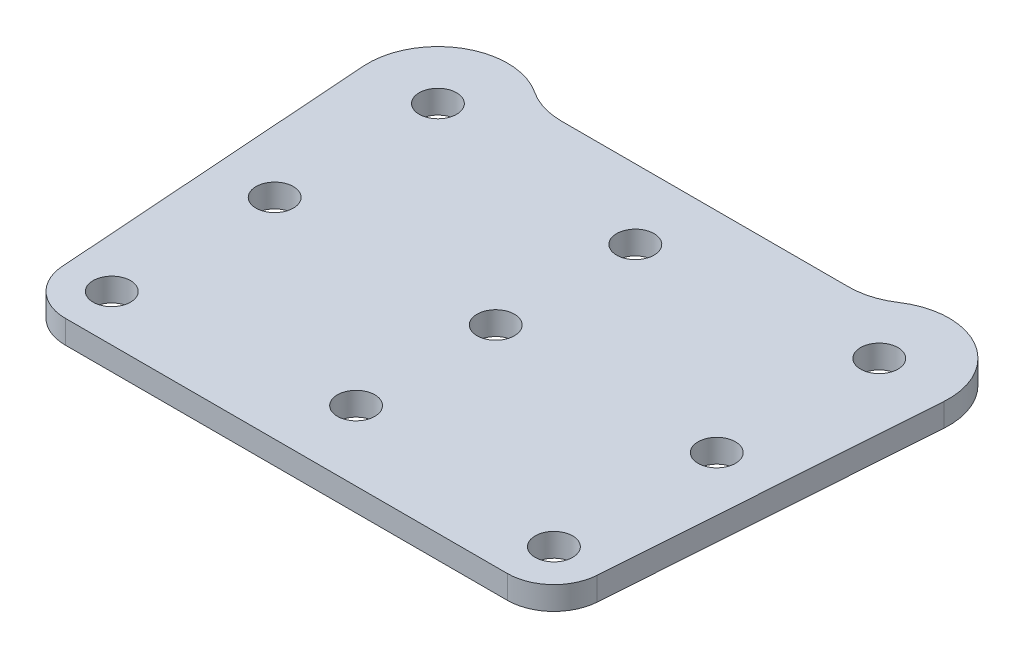
ISO-10303-21;
HEADER;
FILE_DESCRIPTION(('STEP AP214'),'2;1');
FILE_NAME('part.step','',(''),(''),'','','');
FILE_SCHEMA(('AUTOMOTIVE_DESIGN { 1 0 10303 214 1 1 1 1 }'));
ENDSEC;
DATA;
#1=APPLICATION_CONTEXT('core data for automotive mechanical design processes');
#2=APPLICATION_PROTOCOL_DEFINITION('international standard','automotive_design',2000,#1);
#3=PRODUCT_CONTEXT('',#1,'mechanical');
#4=PRODUCT('Part','Part','',(#3));
#5=PRODUCT_RELATED_PRODUCT_CATEGORY('part','',(#4));
#6=PRODUCT_DEFINITION_FORMATION('','',#4);
#7=PRODUCT_DEFINITION_CONTEXT('part definition',#1,'design');
#8=PRODUCT_DEFINITION('design','',#6,#7);
#9=PRODUCT_DEFINITION_SHAPE('','',#8);
#10=(LENGTH_UNIT() NAMED_UNIT(*) SI_UNIT(.MILLI.,.METRE.));
#11=(NAMED_UNIT(*) PLANE_ANGLE_UNIT() SI_UNIT($,.RADIAN.));
#12=(NAMED_UNIT(*) SI_UNIT($,.STERADIAN.) SOLID_ANGLE_UNIT());
#13=UNCERTAINTY_MEASURE_WITH_UNIT(LENGTH_MEASURE(1.E-05),#10,'distance_accuracy_value','');
#14=(GEOMETRIC_REPRESENTATION_CONTEXT(3) GLOBAL_UNCERTAINTY_ASSIGNED_CONTEXT((#13)) GLOBAL_UNIT_ASSIGNED_CONTEXT((#10,
#11,#12)) REPRESENTATION_CONTEXT('',''));
#15=CARTESIAN_POINT('',(0.,0.,0.));
#16=DIRECTION('',(0.,0.,1.));
#17=DIRECTION('',(1.,0.,0.));
#18=AXIS2_PLACEMENT_3D('',#15,#16,#17);
#19=CARTESIAN_POINT('',(-30.1135034,0.,-31.75));
#20=DIRECTION('',(0.,1.,0.));
#21=DIRECTION('',(0.,0.,1.));
#22=AXIS2_PLACEMENT_3D('',#19,#20,#21);
#23=PLANE('',#22);
#24=CARTESIAN_POINT('',(30.1625,0.,-9.52500000000001));
#25=DIRECTION('',(0.,-1.,0.));
#26=DIRECTION('',(0.,0.,-1.));
#27=AXIS2_PLACEMENT_3D('',#24,#25,#26);
#28=CIRCLE('',#27,2.5527);
#29=CARTESIAN_POINT('',(30.1625,0.,-12.0777));
#30=VERTEX_POINT('',#29);
#31=EDGE_CURVE('E164',#30,#30,#28,.F.);
#32=ORIENTED_EDGE('',*,*,#31,.T.);
#33=EDGE_LOOP('',(#32));
#34=FACE_BOUND('',#33,.T.);
#35=CARTESIAN_POINT('',(-30.1625,0.,-9.525));
#36=DIRECTION('',(0.,-1.,0.));
#37=DIRECTION('',(0.,0.,-1.));
#38=AXIS2_PLACEMENT_3D('',#35,#36,#37);
#39=CIRCLE('',#38,2.5527);
#40=CARTESIAN_POINT('',(-30.1625,0.,-12.0777));
#41=VERTEX_POINT('',#40);
#42=EDGE_CURVE('E148',#41,#41,#39,.F.);
#43=ORIENTED_EDGE('',*,*,#42,.T.);
#44=EDGE_LOOP('',(#43));
#45=FACE_BOUND('',#44,.T.);
#46=CARTESIAN_POINT('',(30.1625,0.,12.7));
#47=DIRECTION('',(0.,-1.,0.));
#48=DIRECTION('',(0.,0.,-1.));
#49=AXIS2_PLACEMENT_3D('',#46,#47,#48);
#50=CIRCLE('',#49,2.55269999999999);
#51=CARTESIAN_POINT('',(30.1625,0.,10.1473));
#52=VERTEX_POINT('',#51);
#53=EDGE_CURVE('E170',#52,#52,#50,.F.);
#54=ORIENTED_EDGE('',*,*,#53,.T.);
#55=EDGE_LOOP('',(#54));
#56=FACE_BOUND('',#55,.T.);
#57=CARTESIAN_POINT('',(-30.1625,0.,12.7));
#58=DIRECTION('',(0.,-1.,0.));
#59=DIRECTION('',(0.,0.,-1.));
#60=AXIS2_PLACEMENT_3D('',#57,#58,#59);
#61=CIRCLE('',#60,2.5527);
#62=CARTESIAN_POINT('',(-30.1625,0.,10.1473));
#63=VERTEX_POINT('',#62);
#64=EDGE_CURVE('E143',#63,#63,#61,.F.);
#65=ORIENTED_EDGE('',*,*,#64,.T.);
#66=EDGE_LOOP('',(#65));
#67=FACE_BOUND('',#66,.T.);
#68=CARTESIAN_POINT('',(0.,0.,-28.575));
#69=DIRECTION('',(0.,-1.,0.));
#70=DIRECTION('',(0.,0.,-1.));
#71=AXIS2_PLACEMENT_3D('',#68,#69,#70);
#72=CIRCLE('',#71,2.5527);
#73=CARTESIAN_POINT('',(0.,0.,-31.1277));
#74=VERTEX_POINT('',#73);
#75=EDGE_CURVE('E181',#74,#74,#72,.F.);
#76=ORIENTED_EDGE('',*,*,#75,.T.);
#77=EDGE_LOOP('',(#76));
#78=FACE_BOUND('',#77,.T.);
#79=CARTESIAN_POINT('',(0.,0.,9.525));
#80=DIRECTION('',(0.,-1.,0.));
#81=DIRECTION('',(0.,0.,-1.));
#82=AXIS2_PLACEMENT_3D('',#79,#80,#81);
#83=CIRCLE('',#82,2.5527);
#84=CARTESIAN_POINT('',(0.,0.,6.9723));
#85=VERTEX_POINT('',#84);
#86=EDGE_CURVE('E138',#85,#85,#83,.F.);
#87=ORIENTED_EDGE('',*,*,#86,.T.);
#88=EDGE_LOOP('',(#87));
#89=FACE_BOUND('',#88,.T.);
#90=CARTESIAN_POINT('',(0.,0.,-9.52500000000001));
#91=DIRECTION('',(0.,-1.,0.));
#92=DIRECTION('',(0.,0.,-1.));
#93=AXIS2_PLACEMENT_3D('',#90,#91,#92);
#94=CIRCLE('',#93,2.5527);
#95=CARTESIAN_POINT('',(0.,0.,-12.0777));
#96=VERTEX_POINT('',#95);
#97=EDGE_CURVE('E115',#96,#96,#94,.F.);
#98=ORIENTED_EDGE('',*,*,#97,.T.);
#99=EDGE_LOOP('',(#98));
#100=FACE_BOUND('',#99,.T.);
#101=CARTESIAN_POINT('',(30.1135034,0.,-31.75));
#102=DIRECTION('',(0.,-1.,0.));
#103=DIRECTION('',(0.,0.,-1.));
#104=AXIS2_PLACEMENT_3D('',#101,#102,#103);
#105=CIRCLE('',#104,2.55269999999999);
#106=CARTESIAN_POINT('',(30.1135034,0.,-34.3027));
#107=VERTEX_POINT('',#106);
#108=EDGE_CURVE('E101',#107,#107,#105,.F.);
#109=ORIENTED_EDGE('',*,*,#108,.T.);
#110=EDGE_LOOP('',(#109));
#111=FACE_BOUND('',#110,.T.);
#112=CARTESIAN_POINT('',(-30.1135034,0.,-31.75));
#113=DIRECTION('',(0.,-1.,0.));
#114=DIRECTION('',(0.,0.,-1.));
#115=AXIS2_PLACEMENT_3D('',#112,#113,#114);
#116=CIRCLE('',#115,2.5527);
#117=CARTESIAN_POINT('',(-30.1135034,0.,-34.3027));
#118=VERTEX_POINT('',#117);
#119=EDGE_CURVE('E112',#118,#118,#116,.F.);
#120=ORIENTED_EDGE('',*,*,#119,.T.);
#121=EDGE_LOOP('',(#120));
#122=FACE_BOUND('',#121,.T.);
#123=CARTESIAN_POINT('',(-19.5832196906216,0.,-47.625));
#124=DIRECTION('',(0.,-1.,0.));
#125=DIRECTION('',(0.,0.,-1.));
#126=AXIS2_PLACEMENT_3D('',#123,#124,#125);
#127=CIRCLE('',#126,9.525);
#128=CARTESIAN_POINT('',(-24.8483615453108,0.,-39.6875));
#129=VERTEX_POINT('',#128);
#130=CARTESIAN_POINT('',(-19.5832196906216,0.,-38.1));
#131=VERTEX_POINT('',#130);
#132=EDGE_CURVE('E95',#129,#131,#127,.F.);
#133=ORIENTED_EDGE('',*,*,#132,.T.);
#134=DIRECTION('',(1.,0.,0.));
#135=VECTOR('',#134,1.);
#136=CARTESIAN_POINT('',(-19.5832196906216,0.,-38.1));
#137=LINE('',#136,#135);
#138=CARTESIAN_POINT('',(19.5832196906216,0.,-38.1));
#139=VERTEX_POINT('',#138);
#140=EDGE_CURVE('E476',#131,#139,#137,.T.);
#141=ORIENTED_EDGE('',*,*,#140,.T.);
#142=CARTESIAN_POINT('',(19.5832196906216,0.,-47.625));
#143=DIRECTION('',(0.,-1.,0.));
#144=DIRECTION('',(0.,0.,-1.));
#145=AXIS2_PLACEMENT_3D('',#142,#143,#144);
#146=CIRCLE('',#145,9.52499999999999);
#147=CARTESIAN_POINT('',(24.8483615453108,0.,-39.6875));
#148=VERTEX_POINT('',#147);
#149=EDGE_CURVE('E120',#139,#148,#146,.F.);
#150=ORIENTED_EDGE('',*,*,#149,.T.);
#151=CARTESIAN_POINT('',(30.1135034,0.,-31.75));
#152=DIRECTION('',(0.,-1.,0.));
#153=DIRECTION('',(0.,0.,-1.));
#154=AXIS2_PLACEMENT_3D('',#151,#152,#153);
#155=CIRCLE('',#154,9.525);
#156=CARTESIAN_POINT('',(39.6149180631843,0.,-31.0801161307916));
#157=VERTEX_POINT('',#156);
#158=EDGE_CURVE('E125',#157,#148,#155,.F.);
#159=ORIENTED_EDGE('',*,*,#158,.F.);
#160=DIRECTION('',(-0.07032901513999,0.,0.997523849153211));
#161=VECTOR('',#160,1.);
#162=CARTESIAN_POINT('',(39.6149180631843,0.,-31.0801161307916));
#163=LINE('',#162,#161);
#164=CARTESIAN_POINT('',(36.4967764421229,0.,13.1465892461389));
#165=VERTEX_POINT('',#164);
#166=EDGE_CURVE('E128',#157,#165,#163,.T.);
#167=ORIENTED_EDGE('',*,*,#166,.T.);
#168=CARTESIAN_POINT('',(30.1625,0.,12.7));
#169=DIRECTION('',(0.,-1.,0.));
#170=DIRECTION('',(0.,0.,-1.));
#171=AXIS2_PLACEMENT_3D('',#168,#169,#170);
#172=CIRCLE('',#171,6.35000000000001);
#173=CARTESIAN_POINT('',(30.1625,0.,19.05));
#174=VERTEX_POINT('',#173);
#175=EDGE_CURVE('E129',#174,#165,#172,.F.);
#176=ORIENTED_EDGE('',*,*,#175,.F.);
#177=DIRECTION('',(-1.,0.,0.));
#178=VECTOR('',#177,1.);
#179=CARTESIAN_POINT('',(-30.1625,0.,19.05));
#180=LINE('',#179,#178);
#181=CARTESIAN_POINT('',(-30.1625,0.,19.05));
#182=VERTEX_POINT('',#181);
#183=EDGE_CURVE('E132',#174,#182,#180,.T.);
#184=ORIENTED_EDGE('',*,*,#183,.T.);
#185=CARTESIAN_POINT('',(-30.1625,0.,12.7));
#186=DIRECTION('',(0.,-1.,0.));
#187=DIRECTION('',(0.,0.,-1.));
#188=AXIS2_PLACEMENT_3D('',#185,#186,#187);
#189=CIRCLE('',#188,6.35);
#190=CARTESIAN_POINT('',(-36.4967764421229,0.,13.1465892461389));
#191=VERTEX_POINT('',#190);
#192=EDGE_CURVE('E133',#191,#182,#189,.F.);
#193=ORIENTED_EDGE('',*,*,#192,.F.);
#194=DIRECTION('',(-0.0703290151399903,0.,-0.997523849153211));
#195=VECTOR('',#194,1.);
#196=CARTESIAN_POINT('',(-39.6149180631843,0.,-31.0801161307916));
#197=LINE('',#196,#195);
#198=CARTESIAN_POINT('',(-39.6149180631843,0.,-31.0801161307916));
#199=VERTEX_POINT('',#198);
#200=EDGE_CURVE('E97',#191,#199,#197,.T.);
#201=ORIENTED_EDGE('',*,*,#200,.T.);
#202=CARTESIAN_POINT('',(-30.1135034,0.,-31.75));
#203=DIRECTION('',(0.,-1.,0.));
#204=DIRECTION('',(0.,0.,-1.));
#205=AXIS2_PLACEMENT_3D('',#202,#203,#204);
#206=CIRCLE('',#205,9.525);
#207=EDGE_CURVE('E91',#129,#199,#206,.F.);
#208=ORIENTED_EDGE('',*,*,#207,.F.);
#209=EDGE_LOOP('',(#133,#141,#150,#159,#167,#176,#184,#193,#201,#208));
#210=FACE_BOUND('',#209,.T.);
#211=ADVANCED_FACE('F16',(#34,#45,#56,#67,#78,#89,#100,#111,#122,#210),#23,.F.);
#212=CARTESIAN_POINT('',(-30.1625,3.175,-9.525));
#213=DIRECTION('',(0.,-1.,0.));
#214=DIRECTION('',(0.,0.,-1.));
#215=AXIS2_PLACEMENT_3D('',#212,#213,#214);
#216=CYLINDRICAL_SURFACE('',#215,2.5527);
#217=ORIENTED_EDGE('',*,*,#42,.F.);
#218=EDGE_LOOP('',(#217));
#219=FACE_BOUND('',#218,.T.);
#220=CARTESIAN_POINT('',(-30.1625,3.175,-9.525));
#221=DIRECTION('',(0.,-1.,0.));
#222=DIRECTION('',(0.,0.,-1.));
#223=AXIS2_PLACEMENT_3D('',#220,#221,#222);
#224=CIRCLE('',#223,2.5527);
#225=CARTESIAN_POINT('',(-30.1625,3.175,-12.0777));
#226=VERTEX_POINT('',#225);
#227=EDGE_CURVE('E161',#226,#226,#224,.T.);
#228=ORIENTED_EDGE('',*,*,#227,.F.);
#229=EDGE_LOOP('',(#228));
#230=FACE_BOUND('',#229,.T.);
#231=ADVANCED_FACE('F155',(#219,#230),#216,.F.);
#232=CARTESIAN_POINT('',(-30.1625,3.175,12.7));
#233=DIRECTION('',(0.,-1.,0.));
#234=DIRECTION('',(0.,0.,-1.));
#235=AXIS2_PLACEMENT_3D('',#232,#233,#234);
#236=CYLINDRICAL_SURFACE('',#235,2.5527);
#237=ORIENTED_EDGE('',*,*,#64,.F.);
#238=EDGE_LOOP('',(#237));
#239=FACE_BOUND('',#238,.T.);
#240=CARTESIAN_POINT('',(-30.1625,3.175,12.7));
#241=DIRECTION('',(0.,-1.,0.));
#242=DIRECTION('',(0.,0.,-1.));
#243=AXIS2_PLACEMENT_3D('',#240,#241,#242);
#244=CIRCLE('',#243,2.5527);
#245=CARTESIAN_POINT('',(-30.1625,3.175,10.1473));
#246=VERTEX_POINT('',#245);
#247=EDGE_CURVE('E163',#246,#246,#244,.T.);
#248=ORIENTED_EDGE('',*,*,#247,.F.);
#249=EDGE_LOOP('',(#248));
#250=FACE_BOUND('',#249,.T.);
#251=ADVANCED_FACE('F158',(#239,#250),#236,.F.);
#252=CARTESIAN_POINT('',(0.,3.175,9.525));
#253=DIRECTION('',(0.,-1.,0.));
#254=DIRECTION('',(0.,0.,-1.));
#255=AXIS2_PLACEMENT_3D('',#252,#253,#254);
#256=CYLINDRICAL_SURFACE('',#255,2.5527);
#257=ORIENTED_EDGE('',*,*,#86,.F.);
#258=EDGE_LOOP('',(#257));
#259=FACE_BOUND('',#258,.T.);
#260=CARTESIAN_POINT('',(0.,3.175,9.525));
#261=DIRECTION('',(0.,-1.,0.));
#262=DIRECTION('',(0.,0.,-1.));
#263=AXIS2_PLACEMENT_3D('',#260,#261,#262);
#264=CIRCLE('',#263,2.5527);
#265=CARTESIAN_POINT('',(0.,3.175,6.9723));
#266=VERTEX_POINT('',#265);
#267=EDGE_CURVE('E167',#266,#266,#264,.T.);
#268=ORIENTED_EDGE('',*,*,#267,.F.);
#269=EDGE_LOOP('',(#268));
#270=FACE_BOUND('',#269,.T.);
#271=ADVANCED_FACE('F251',(#259,#270),#256,.F.);
#272=CARTESIAN_POINT('',(30.1135034,3.175,-31.75));
#273=DIRECTION('',(0.,-1.,0.));
#274=DIRECTION('',(0.,0.,-1.));
#275=AXIS2_PLACEMENT_3D('',#272,#273,#274);
#276=CYLINDRICAL_SURFACE('',#275,2.55269999999999);
#277=ORIENTED_EDGE('',*,*,#108,.F.);
#278=EDGE_LOOP('',(#277));
#279=FACE_BOUND('',#278,.T.);
#280=CARTESIAN_POINT('',(30.1135034,3.175,-31.75));
#281=DIRECTION('',(0.,-1.,0.));
#282=DIRECTION('',(0.,0.,-1.));
#283=AXIS2_PLACEMENT_3D('',#280,#281,#282);
#284=CIRCLE('',#283,2.55269999999999);
#285=CARTESIAN_POINT('',(30.1135034,3.175,-34.3027));
#286=VERTEX_POINT('',#285);
#287=EDGE_CURVE('E238',#286,#286,#284,.T.);
#288=ORIENTED_EDGE('',*,*,#287,.F.);
#289=EDGE_LOOP('',(#288));
#290=FACE_BOUND('',#289,.T.);
#291=ADVANCED_FACE('F253',(#279,#290),#276,.F.);
#292=CARTESIAN_POINT('',(-30.1135034,3.175,-31.75));
#293=DIRECTION('',(0.,-1.,0.));
#294=DIRECTION('',(0.,0.,-1.));
#295=AXIS2_PLACEMENT_3D('',#292,#293,#294);
#296=CYLINDRICAL_SURFACE('',#295,9.525);
#297=CARTESIAN_POINT('',(-30.1135034,3.175,-31.75));
#298=DIRECTION('',(0.,-1.,0.));
#299=DIRECTION('',(0.,0.,-1.));
#300=AXIS2_PLACEMENT_3D('',#297,#298,#299);
#301=CIRCLE('',#300,9.525);
#302=CARTESIAN_POINT('',(-24.8483615453108,3.175,-39.6875));
#303=VERTEX_POINT('',#302);
#304=CARTESIAN_POINT('',(-39.6149180631843,3.175,-31.0801161307916));
#305=VERTEX_POINT('',#304);
#306=EDGE_CURVE('E107',#303,#305,#301,.F.);
#307=ORIENTED_EDGE('',*,*,#306,.F.);
#308=DIRECTION('',(0.,-1.,0.));
#309=VECTOR('',#308,1.);
#310=CARTESIAN_POINT('',(-24.8483615453108,3.175,-39.6875));
#311=LINE('',#310,#309);
#312=EDGE_CURVE('E104',#303,#129,#311,.T.);
#313=ORIENTED_EDGE('',*,*,#312,.T.);
#314=ORIENTED_EDGE('',*,*,#207,.T.);
#315=DIRECTION('',(0.,1.,0.));
#316=VECTOR('',#315,1.);
#317=CARTESIAN_POINT('',(-39.6149180631843,3.175,-31.0801161307916));
#318=LINE('',#317,#316);
#319=EDGE_CURVE('E100',#199,#305,#318,.T.);
#320=ORIENTED_EDGE('',*,*,#319,.T.);
#321=EDGE_LOOP('',(#307,#313,#314,#320));
#322=FACE_BOUND('',#321,.T.);
#323=ADVANCED_FACE('F105',(#322),#296,.T.);
#324=CARTESIAN_POINT('',(-39.6149180631843,3.175,-31.0801161307916));
#325=DIRECTION('',(0.997523849153211,0.,-0.0703290151399903));
#326=DIRECTION('',(-0.0703290151399903,0.,-0.997523849153211));
#327=AXIS2_PLACEMENT_3D('',#324,#325,#326);
#328=PLANE('',#327);
#329=DIRECTION('',(0.,-1.,0.));
#330=VECTOR('',#329,1.);
#331=CARTESIAN_POINT('',(-36.4967764421229,3.175,13.1465892461389));
#332=LINE('',#331,#330);
#333=CARTESIAN_POINT('',(-36.4967764421229,3.175,13.1465892461389));
#334=VERTEX_POINT('',#333);
#335=EDGE_CURVE('E134',#334,#191,#332,.T.);
#336=ORIENTED_EDGE('',*,*,#335,.F.);
#337=DIRECTION('',(0.0703290151399903,0.,0.997523849153212));
#338=VECTOR('',#337,1.);
#339=CARTESIAN_POINT('',(-39.6149180631843,3.175,-31.0801161307916));
#340=LINE('',#339,#338);
#341=EDGE_CURVE('E236',#305,#334,#340,.T.);
#342=ORIENTED_EDGE('',*,*,#341,.F.);
#343=ORIENTED_EDGE('',*,*,#319,.F.);
#344=ORIENTED_EDGE('',*,*,#200,.F.);
#345=EDGE_LOOP('',(#336,#342,#343,#344));
#346=FACE_BOUND('',#345,.T.);
#347=ADVANCED_FACE('F315',(#346),#328,.F.);
#348=CARTESIAN_POINT('',(-30.1625,3.175,12.7));
#349=DIRECTION('',(0.,-1.,0.));
#350=DIRECTION('',(0.,0.,-1.));
#351=AXIS2_PLACEMENT_3D('',#348,#349,#350);
#352=CYLINDRICAL_SURFACE('',#351,6.35);
#353=CARTESIAN_POINT('',(-30.1625,3.175,12.7));
#354=DIRECTION('',(0.,-1.,0.));
#355=DIRECTION('',(0.,0.,-1.));
#356=AXIS2_PLACEMENT_3D('',#353,#354,#355);
#357=CIRCLE('',#356,6.35);
#358=CARTESIAN_POINT('',(-30.1625,3.175,19.05));
#359=VERTEX_POINT('',#358);
#360=EDGE_CURVE('E233',#334,#359,#357,.F.);
#361=ORIENTED_EDGE('',*,*,#360,.F.);
#362=ORIENTED_EDGE('',*,*,#335,.T.);
#363=ORIENTED_EDGE('',*,*,#192,.T.);
#364=DIRECTION('',(0.,1.,0.));
#365=VECTOR('',#364,1.);
#366=CARTESIAN_POINT('',(-30.1625,3.175,19.05));
#367=LINE('',#366,#365);
#368=EDGE_CURVE('E464',#182,#359,#367,.T.);
#369=ORIENTED_EDGE('',*,*,#368,.T.);
#370=EDGE_LOOP('',(#361,#362,#363,#369));
#371=FACE_BOUND('',#370,.T.);
#372=ADVANCED_FACE('F311',(#371),#352,.T.);
#373=CARTESIAN_POINT('',(-30.1625,3.175,19.05));
#374=DIRECTION('',(0.,0.,-1.));
#375=DIRECTION('',(-1.,0.,0.));
#376=AXIS2_PLACEMENT_3D('',#373,#374,#375);
#377=PLANE('',#376);
#378=DIRECTION('',(0.,-1.,0.));
#379=VECTOR('',#378,1.);
#380=CARTESIAN_POINT('',(30.1625,3.175,19.05));
#381=LINE('',#380,#379);
#382=CARTESIAN_POINT('',(30.1625,3.175,19.05));
#383=VERTEX_POINT('',#382);
#384=EDGE_CURVE('E131',#383,#174,#381,.T.);
#385=ORIENTED_EDGE('',*,*,#384,.F.);
#386=DIRECTION('',(1.,0.,0.));
#387=VECTOR('',#386,1.);
#388=CARTESIAN_POINT('',(-30.1135034,3.175,19.05));
#389=LINE('',#388,#387);
#390=EDGE_CURVE('E232',#359,#383,#389,.T.);
#391=ORIENTED_EDGE('',*,*,#390,.F.);
#392=ORIENTED_EDGE('',*,*,#368,.F.);
#393=ORIENTED_EDGE('',*,*,#183,.F.);
#394=EDGE_LOOP('',(#385,#391,#392,#393));
#395=FACE_BOUND('',#394,.T.);
#396=ADVANCED_FACE('F307',(#395),#377,.F.);
#397=CARTESIAN_POINT('',(30.1625,3.175,12.7));
#398=DIRECTION('',(0.,-1.,0.));
#399=DIRECTION('',(0.,0.,-1.));
#400=AXIS2_PLACEMENT_3D('',#397,#398,#399);
#401=CYLINDRICAL_SURFACE('',#400,6.35000000000001);
#402=CARTESIAN_POINT('',(30.1625,3.175,12.7));
#403=DIRECTION('',(0.,-1.,0.));
#404=DIRECTION('',(0.,0.,-1.));
#405=AXIS2_PLACEMENT_3D('',#402,#403,#404);
#406=CIRCLE('',#405,6.35000000000001);
#407=CARTESIAN_POINT('',(36.4967764421229,3.175,13.1465892461389));
#408=VERTEX_POINT('',#407);
#409=EDGE_CURVE('E229',#383,#408,#406,.F.);
#410=ORIENTED_EDGE('',*,*,#409,.F.);
#411=ORIENTED_EDGE('',*,*,#384,.T.);
#412=ORIENTED_EDGE('',*,*,#175,.T.);
#413=DIRECTION('',(0.,1.,0.));
#414=VECTOR('',#413,1.);
#415=CARTESIAN_POINT('',(36.4967764421229,3.175,13.1465892461389));
#416=LINE('',#415,#414);
#417=EDGE_CURVE('E482',#165,#408,#416,.T.);
#418=ORIENTED_EDGE('',*,*,#417,.T.);
#419=EDGE_LOOP('',(#410,#411,#412,#418));
#420=FACE_BOUND('',#419,.T.);
#421=ADVANCED_FACE('F303',(#420),#401,.T.);
#422=CARTESIAN_POINT('',(39.6149180631843,3.175,-31.0801161307916));
#423=DIRECTION('',(-0.997523849153211,0.,-0.07032901513999));
#424=DIRECTION('',(-0.07032901513999,0.,0.997523849153211));
#425=AXIS2_PLACEMENT_3D('',#422,#423,#424);
#426=PLANE('',#425);
#427=DIRECTION('',(0.,-1.,0.));
#428=VECTOR('',#427,1.);
#429=CARTESIAN_POINT('',(39.6149180631843,3.175,-31.0801161307916));
#430=LINE('',#429,#428);
#431=CARTESIAN_POINT('',(39.6149180631843,3.175,-31.0801161307916));
#432=VERTEX_POINT('',#431);
#433=EDGE_CURVE('E127',#432,#157,#430,.T.);
#434=ORIENTED_EDGE('',*,*,#433,.F.);
#435=DIRECTION('',(0.0703290151399905,0.,-0.997523849153212));
#436=VECTOR('',#435,1.);
#437=CARTESIAN_POINT('',(36.4967764421229,3.175,13.1465892461389));
#438=LINE('',#437,#436);
#439=EDGE_CURVE('E228',#408,#432,#438,.T.);
#440=ORIENTED_EDGE('',*,*,#439,.F.);
#441=ORIENTED_EDGE('',*,*,#417,.F.);
#442=ORIENTED_EDGE('',*,*,#166,.F.);
#443=EDGE_LOOP('',(#434,#440,#441,#442));
#444=FACE_BOUND('',#443,.T.);
#445=ADVANCED_FACE('F299',(#444),#426,.F.);
#446=CARTESIAN_POINT('',(30.1135034,3.175,-31.75));
#447=DIRECTION('',(0.,-1.,0.));
#448=DIRECTION('',(0.,0.,-1.));
#449=AXIS2_PLACEMENT_3D('',#446,#447,#448);
#450=CYLINDRICAL_SURFACE('',#449,9.525);
#451=CARTESIAN_POINT('',(30.1135034,3.175,-31.75));
#452=DIRECTION('',(0.,-1.,0.));
#453=DIRECTION('',(0.,0.,-1.));
#454=AXIS2_PLACEMENT_3D('',#451,#452,#453);
#455=CIRCLE('',#454,9.525);
#456=CARTESIAN_POINT('',(24.8483615453108,3.175,-39.6875));
#457=VERTEX_POINT('',#456);
#458=EDGE_CURVE('E225',#432,#457,#455,.F.);
#459=ORIENTED_EDGE('',*,*,#458,.F.);
#460=ORIENTED_EDGE('',*,*,#433,.T.);
#461=ORIENTED_EDGE('',*,*,#158,.T.);
#462=DIRECTION('',(0.,-1.,0.));
#463=VECTOR('',#462,1.);
#464=CARTESIAN_POINT('',(24.8483615453108,3.175,-39.6875));
#465=LINE('',#464,#463);
#466=EDGE_CURVE('E124',#148,#457,#465,.F.);
#467=ORIENTED_EDGE('',*,*,#466,.T.);
#468=EDGE_LOOP('',(#459,#460,#461,#467));
#469=FACE_BOUND('',#468,.T.);
#470=ADVANCED_FACE('F295',(#469),#450,.T.);
#471=CARTESIAN_POINT('',(19.5832196906216,3.175,-47.625));
#472=DIRECTION('',(0.,-1.,0.));
#473=DIRECTION('',(0.,0.,-1.));
#474=AXIS2_PLACEMENT_3D('',#471,#472,#473);
#475=CYLINDRICAL_SURFACE('',#474,9.52499999999999);
#476=DIRECTION('',(0.,1.,0.));
#477=VECTOR('',#476,1.);
#478=CARTESIAN_POINT('',(19.5832196906216,3.175,-38.1));
#479=LINE('',#478,#477);
#480=CARTESIAN_POINT('',(19.5832196906216,3.175,-38.1));
#481=VERTEX_POINT('',#480);
#482=EDGE_CURVE('E123',#139,#481,#479,.T.);
#483=ORIENTED_EDGE('',*,*,#482,.T.);
#484=CARTESIAN_POINT('',(19.5832196906216,3.175,-47.625));
#485=DIRECTION('',(0.,-1.,0.));
#486=DIRECTION('',(0.,0.,-1.));
#487=AXIS2_PLACEMENT_3D('',#484,#485,#486);
#488=CIRCLE('',#487,9.52499999999999);
#489=EDGE_CURVE('E222',#457,#481,#488,.T.);
#490=ORIENTED_EDGE('',*,*,#489,.F.);
#491=ORIENTED_EDGE('',*,*,#466,.F.);
#492=ORIENTED_EDGE('',*,*,#149,.F.);
#493=EDGE_LOOP('',(#483,#490,#491,#492));
#494=FACE_BOUND('',#493,.T.);
#495=ADVANCED_FACE('F292',(#494),#475,.F.);
#496=CARTESIAN_POINT('',(-19.5832196906216,3.175,-38.1));
#497=DIRECTION('',(0.,0.,1.));
#498=DIRECTION('',(1.,0.,0.));
#499=AXIS2_PLACEMENT_3D('',#496,#497,#498);
#500=PLANE('',#499);
#501=DIRECTION('',(0.,-1.,0.));
#502=VECTOR('',#501,1.);
#503=CARTESIAN_POINT('',(-19.5832196906216,3.175,-38.1));
#504=LINE('',#503,#502);
#505=CARTESIAN_POINT('',(-19.5832196906216,3.175,-38.1));
#506=VERTEX_POINT('',#505);
#507=EDGE_CURVE('E34',#131,#506,#504,.F.);
#508=ORIENTED_EDGE('',*,*,#507,.T.);
#509=DIRECTION('',(1.,0.,0.));
#510=VECTOR('',#509,1.);
#511=CARTESIAN_POINT('',(-30.1135034,3.175,-38.1));
#512=LINE('',#511,#510);
#513=EDGE_CURVE('E221',#481,#506,#512,.F.);
#514=ORIENTED_EDGE('',*,*,#513,.F.);
#515=ORIENTED_EDGE('',*,*,#482,.F.);
#516=ORIENTED_EDGE('',*,*,#140,.F.);
#517=EDGE_LOOP('',(#508,#514,#515,#516));
#518=FACE_BOUND('',#517,.T.);
#519=ADVANCED_FACE('F289',(#518),#500,.F.);
#520=CARTESIAN_POINT('',(-19.5832196906216,3.175,-47.625));
#521=DIRECTION('',(0.,-1.,0.));
#522=DIRECTION('',(0.,0.,-1.));
#523=AXIS2_PLACEMENT_3D('',#520,#521,#522);
#524=CYLINDRICAL_SURFACE('',#523,9.525);
#525=ORIENTED_EDGE('',*,*,#312,.F.);
#526=CARTESIAN_POINT('',(-19.5832196906216,3.175,-47.625));
#527=DIRECTION('',(0.,-1.,0.));
#528=DIRECTION('',(0.,0.,-1.));
#529=AXIS2_PLACEMENT_3D('',#526,#527,#528);
#530=CIRCLE('',#529,9.525);
#531=EDGE_CURVE('E211',#506,#303,#530,.T.);
#532=ORIENTED_EDGE('',*,*,#531,.F.);
#533=ORIENTED_EDGE('',*,*,#507,.F.);
#534=ORIENTED_EDGE('',*,*,#132,.F.);
#535=EDGE_LOOP('',(#525,#532,#533,#534));
#536=FACE_BOUND('',#535,.T.);
#537=ADVANCED_FACE('F111',(#536),#524,.F.);
#538=CARTESIAN_POINT('',(-30.1135034,3.175,-31.75));
#539=DIRECTION('',(0.,-1.,0.));
#540=DIRECTION('',(0.,0.,-1.));
#541=AXIS2_PLACEMENT_3D('',#538,#539,#540);
#542=CYLINDRICAL_SURFACE('',#541,2.5527);
#543=ORIENTED_EDGE('',*,*,#119,.F.);
#544=EDGE_LOOP('',(#543));
#545=FACE_BOUND('',#544,.T.);
#546=CARTESIAN_POINT('',(-30.1135034,3.175,-31.75));
#547=DIRECTION('',(0.,-1.,0.));
#548=DIRECTION('',(0.,0.,-1.));
#549=AXIS2_PLACEMENT_3D('',#546,#547,#548);
#550=CIRCLE('',#549,2.5527);
#551=CARTESIAN_POINT('',(-30.1135034,3.175,-34.3027));
#552=VERTEX_POINT('',#551);
#553=EDGE_CURVE('E206',#552,#552,#550,.T.);
#554=ORIENTED_EDGE('',*,*,#553,.F.);
#555=EDGE_LOOP('',(#554));
#556=FACE_BOUND('',#555,.T.);
#557=ADVANCED_FACE('F199',(#545,#556),#542,.F.);
#558=CARTESIAN_POINT('',(0.,3.175,-9.52500000000001));
#559=DIRECTION('',(0.,-1.,0.));
#560=DIRECTION('',(0.,0.,-1.));
#561=AXIS2_PLACEMENT_3D('',#558,#559,#560);
#562=CYLINDRICAL_SURFACE('',#561,2.5527);
#563=ORIENTED_EDGE('',*,*,#97,.F.);
#564=EDGE_LOOP('',(#563));
#565=FACE_BOUND('',#564,.T.);
#566=CARTESIAN_POINT('',(0.,3.175,-9.52500000000001));
#567=DIRECTION('',(0.,-1.,0.));
#568=DIRECTION('',(0.,0.,-1.));
#569=AXIS2_PLACEMENT_3D('',#566,#567,#568);
#570=CIRCLE('',#569,2.5527);
#571=CARTESIAN_POINT('',(0.,3.175,-12.0777));
#572=VERTEX_POINT('',#571);
#573=EDGE_CURVE('E203',#572,#572,#570,.T.);
#574=ORIENTED_EDGE('',*,*,#573,.F.);
#575=EDGE_LOOP('',(#574));
#576=FACE_BOUND('',#575,.T.);
#577=ADVANCED_FACE('F195',(#565,#576),#562,.F.);
#578=CARTESIAN_POINT('',(0.,3.175,-28.575));
#579=DIRECTION('',(0.,-1.,0.));
#580=DIRECTION('',(0.,0.,-1.));
#581=AXIS2_PLACEMENT_3D('',#578,#579,#580);
#582=CYLINDRICAL_SURFACE('',#581,2.5527);
#583=ORIENTED_EDGE('',*,*,#75,.F.);
#584=EDGE_LOOP('',(#583));
#585=FACE_BOUND('',#584,.T.);
#586=CARTESIAN_POINT('',(0.,3.175,-28.575));
#587=DIRECTION('',(0.,-1.,0.));
#588=DIRECTION('',(0.,0.,-1.));
#589=AXIS2_PLACEMENT_3D('',#586,#587,#588);
#590=CIRCLE('',#589,2.5527);
#591=CARTESIAN_POINT('',(0.,3.175,-31.1277));
#592=VERTEX_POINT('',#591);
#593=EDGE_CURVE('E205',#592,#592,#590,.T.);
#594=ORIENTED_EDGE('',*,*,#593,.F.);
#595=EDGE_LOOP('',(#594));
#596=FACE_BOUND('',#595,.T.);
#597=ADVANCED_FACE('F198',(#585,#596),#582,.F.);
#598=CARTESIAN_POINT('',(30.1625,3.175,12.7));
#599=DIRECTION('',(0.,-1.,0.));
#600=DIRECTION('',(0.,0.,-1.));
#601=AXIS2_PLACEMENT_3D('',#598,#599,#600);
#602=CYLINDRICAL_SURFACE('',#601,2.55269999999999);
#603=ORIENTED_EDGE('',*,*,#53,.F.);
#604=EDGE_LOOP('',(#603));
#605=FACE_BOUND('',#604,.T.);
#606=CARTESIAN_POINT('',(30.1625,3.175,12.7));
#607=DIRECTION('',(0.,-1.,0.));
#608=DIRECTION('',(0.,0.,-1.));
#609=AXIS2_PLACEMENT_3D('',#606,#607,#608);
#610=CIRCLE('',#609,2.55269999999999);
#611=CARTESIAN_POINT('',(30.1625,3.175,10.1473));
#612=VERTEX_POINT('',#611);
#613=EDGE_CURVE('E25',#612,#612,#610,.T.);
#614=ORIENTED_EDGE('',*,*,#613,.F.);
#615=EDGE_LOOP('',(#614));
#616=FACE_BOUND('',#615,.T.);
#617=ADVANCED_FACE('F273',(#605,#616),#602,.F.);
#618=CARTESIAN_POINT('',(30.1625,3.175,-9.52500000000001));
#619=DIRECTION('',(0.,-1.,0.));
#620=DIRECTION('',(0.,0.,-1.));
#621=AXIS2_PLACEMENT_3D('',#618,#619,#620);
#622=CYLINDRICAL_SURFACE('',#621,2.5527);
#623=ORIENTED_EDGE('',*,*,#31,.F.);
#624=EDGE_LOOP('',(#623));
#625=FACE_BOUND('',#624,.T.);
#626=CARTESIAN_POINT('',(30.1625,3.175,-9.52500000000001));
#627=DIRECTION('',(0.,-1.,0.));
#628=DIRECTION('',(0.,0.,-1.));
#629=AXIS2_PLACEMENT_3D('',#626,#627,#628);
#630=CIRCLE('',#629,2.5527);
#631=CARTESIAN_POINT('',(30.1625,3.175,-12.0777));
#632=VERTEX_POINT('',#631);
#633=EDGE_CURVE('E11',#632,#632,#630,.T.);
#634=ORIENTED_EDGE('',*,*,#633,.F.);
#635=EDGE_LOOP('',(#634));
#636=FACE_BOUND('',#635,.T.);
#637=ADVANCED_FACE('F267',(#625,#636),#622,.F.);
#638=CARTESIAN_POINT('',(-30.1135034,3.175,-31.75));
#639=DIRECTION('',(0.,1.,0.));
#640=DIRECTION('',(0.,0.,1.));
#641=AXIS2_PLACEMENT_3D('',#638,#639,#640);
#642=PLANE('',#641);
#643=ORIENTED_EDGE('',*,*,#633,.T.);
#644=EDGE_LOOP('',(#643));
#645=FACE_BOUND('',#644,.T.);
#646=ORIENTED_EDGE('',*,*,#613,.T.);
#647=EDGE_LOOP('',(#646));
#648=FACE_BOUND('',#647,.T.);
#649=ORIENTED_EDGE('',*,*,#593,.T.);
#650=EDGE_LOOP('',(#649));
#651=FACE_BOUND('',#650,.T.);
#652=ORIENTED_EDGE('',*,*,#573,.T.);
#653=EDGE_LOOP('',(#652));
#654=FACE_BOUND('',#653,.T.);
#655=ORIENTED_EDGE('',*,*,#553,.T.);
#656=EDGE_LOOP('',(#655));
#657=FACE_BOUND('',#656,.T.);
#658=ORIENTED_EDGE('',*,*,#513,.T.);
#659=ORIENTED_EDGE('',*,*,#531,.T.);
#660=ORIENTED_EDGE('',*,*,#306,.T.);
#661=ORIENTED_EDGE('',*,*,#341,.T.);
#662=ORIENTED_EDGE('',*,*,#360,.T.);
#663=ORIENTED_EDGE('',*,*,#390,.T.);
#664=ORIENTED_EDGE('',*,*,#409,.T.);
#665=ORIENTED_EDGE('',*,*,#439,.T.);
#666=ORIENTED_EDGE('',*,*,#458,.T.);
#667=ORIENTED_EDGE('',*,*,#489,.T.);
#668=EDGE_LOOP('',(#658,#659,#660,#661,#662,#663,#664,#665,#666,#667));
#669=FACE_BOUND('',#668,.T.);
#670=ORIENTED_EDGE('',*,*,#287,.T.);
#671=EDGE_LOOP('',(#670));
#672=FACE_BOUND('',#671,.T.);
#673=ORIENTED_EDGE('',*,*,#267,.T.);
#674=EDGE_LOOP('',(#673));
#675=FACE_BOUND('',#674,.T.);
#676=ORIENTED_EDGE('',*,*,#247,.T.);
#677=EDGE_LOOP('',(#676));
#678=FACE_BOUND('',#677,.T.);
#679=ORIENTED_EDGE('',*,*,#227,.T.);
#680=EDGE_LOOP('',(#679));
#681=FACE_BOUND('',#680,.T.);
#682=ADVANCED_FACE('F248',(#645,#648,#651,#654,#657,#669,#672,#675,#678,#681),#642,.T.);
#683=CLOSED_SHELL('',(#211,#231,#251,#271,#291,#323,#347,#372,#396,#421,#445,#470,#495,#519,
#537,#557,#577,#597,#617,#637,#682));
#684=MANIFOLD_SOLID_BREP('B1',#683);
#685=ADVANCED_BREP_SHAPE_REPRESENTATION('',(#18,#684),#14);
#686=SHAPE_DEFINITION_REPRESENTATION(#9,#685);
ENDSEC;
END-ISO-10303-21;
